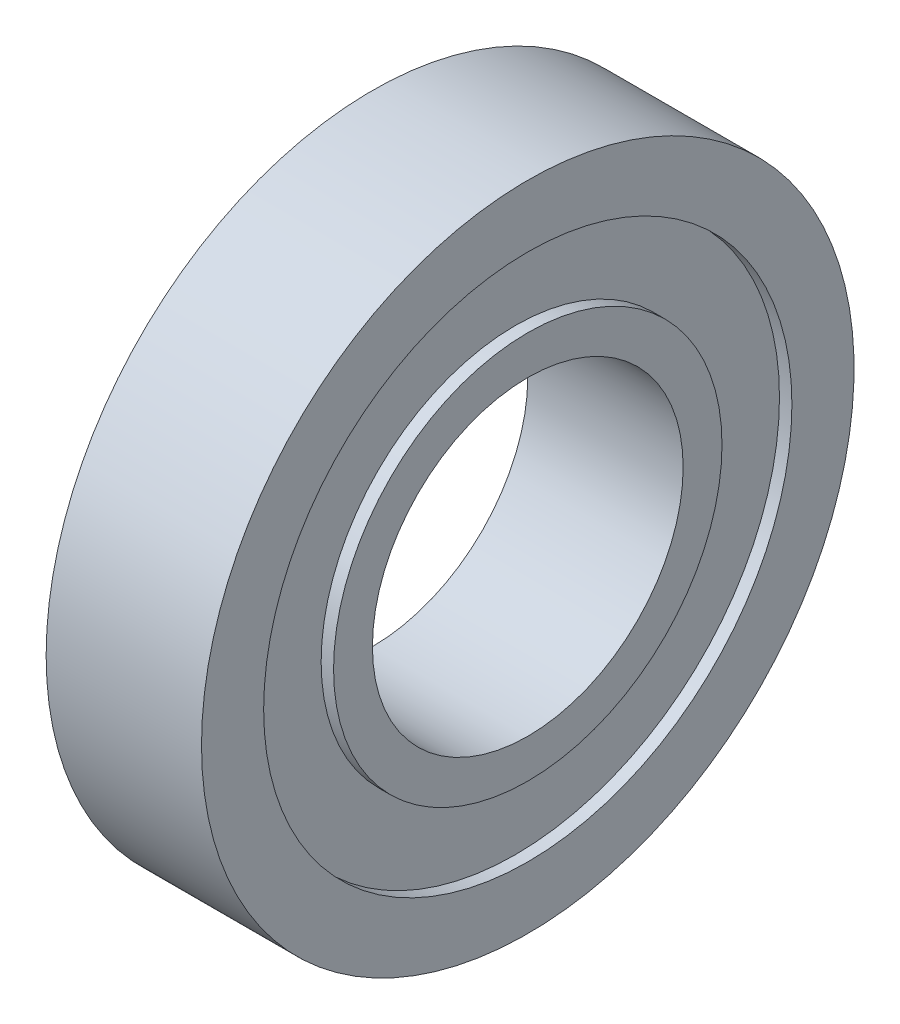
ISO-10303-21;
HEADER;
FILE_DESCRIPTION(('STEP AP214'),'2;1');
FILE_NAME('part.step','',(''),(''),'','','');
FILE_SCHEMA(('AUTOMOTIVE_DESIGN { 1 0 10303 214 1 1 1 1 }'));
ENDSEC;
DATA;
#1=APPLICATION_CONTEXT('core data for automotive mechanical design processes');
#2=APPLICATION_PROTOCOL_DEFINITION('international standard','automotive_design',2000,#1);
#3=PRODUCT_CONTEXT('',#1,'mechanical');
#4=PRODUCT('Part','Part','',(#3));
#5=PRODUCT_RELATED_PRODUCT_CATEGORY('part','',(#4));
#6=PRODUCT_DEFINITION_FORMATION('','',#4);
#7=PRODUCT_DEFINITION_CONTEXT('part definition',#1,'design');
#8=PRODUCT_DEFINITION('design','',#6,#7);
#9=PRODUCT_DEFINITION_SHAPE('','',#8);
#10=(LENGTH_UNIT() NAMED_UNIT(*) SI_UNIT(.MILLI.,.METRE.));
#11=(NAMED_UNIT(*) PLANE_ANGLE_UNIT() SI_UNIT($,.RADIAN.));
#12=(NAMED_UNIT(*) SI_UNIT($,.STERADIAN.) SOLID_ANGLE_UNIT());
#13=UNCERTAINTY_MEASURE_WITH_UNIT(LENGTH_MEASURE(1.E-05),#10,'distance_accuracy_value','');
#14=(GEOMETRIC_REPRESENTATION_CONTEXT(3) GLOBAL_UNCERTAINTY_ASSIGNED_CONTEXT((#13)) GLOBAL_UNIT_ASSIGNED_CONTEXT((#10,
#11,#12)) REPRESENTATION_CONTEXT('',''));
#15=CARTESIAN_POINT('',(0.,0.,0.));
#16=DIRECTION('',(0.,0.,1.));
#17=DIRECTION('',(1.,0.,0.));
#18=AXIS2_PLACEMENT_3D('',#15,#16,#17);
#19=CARTESIAN_POINT('',(0.,0.,0.));
#20=DIRECTION('',(-1.,0.,0.));
#21=DIRECTION('',(0.,0.,1.));
#22=AXIS2_PLACEMENT_3D('',#19,#20,#21);
#23=CYLINDRICAL_SURFACE('',#22,5.);
#24=CARTESIAN_POINT('',(5.,0.,0.));
#25=DIRECTION('',(-1.,0.,0.));
#26=DIRECTION('',(0.,0.,1.));
#27=AXIS2_PLACEMENT_3D('',#24,#25,#26);
#28=CIRCLE('',#27,5.);
#29=CARTESIAN_POINT('',(5.,0.,5.));
#30=VERTEX_POINT('',#29);
#31=EDGE_CURVE('E94',#30,#30,#28,.T.);
#32=ORIENTED_EDGE('',*,*,#31,.F.);
#33=EDGE_LOOP('',(#32));
#34=FACE_BOUND('',#33,.T.);
#35=CARTESIAN_POINT('',(0.,0.,0.));
#36=DIRECTION('',(-1.,0.,0.));
#37=DIRECTION('',(0.,0.,1.));
#38=AXIS2_PLACEMENT_3D('',#35,#36,#37);
#39=CIRCLE('',#38,5.);
#40=CARTESIAN_POINT('',(0.,0.,5.));
#41=VERTEX_POINT('',#40);
#42=EDGE_CURVE('E10',#41,#41,#39,.T.);
#43=ORIENTED_EDGE('',*,*,#42,.T.);
#44=EDGE_LOOP('',(#43));
#45=FACE_BOUND('',#44,.T.);
#46=ADVANCED_FACE('F43',(#34,#45),#23,.F.);
#47=CARTESIAN_POINT('',(0.,0.,-5.));
#48=DIRECTION('',(1.,0.,0.));
#49=DIRECTION('',(0.,0.,-1.));
#50=AXIS2_PLACEMENT_3D('',#47,#48,#49);
#51=PLANE('',#50);
#52=ORIENTED_EDGE('',*,*,#42,.F.);
#53=EDGE_LOOP('',(#52));
#54=FACE_BOUND('',#53,.T.);
#55=CARTESIAN_POINT('',(0.,0.,0.));
#56=DIRECTION('',(-1.,0.,0.));
#57=DIRECTION('',(0.,0.,1.));
#58=AXIS2_PLACEMENT_3D('',#55,#56,#57);
#59=CIRCLE('',#58,6.25);
#60=CARTESIAN_POINT('',(0.,0.,6.25));
#61=VERTEX_POINT('',#60);
#62=EDGE_CURVE('E50',#61,#61,#59,.T.);
#63=ORIENTED_EDGE('',*,*,#62,.T.);
#64=EDGE_LOOP('',(#63));
#65=FACE_BOUND('',#64,.T.);
#66=ADVANCED_FACE('F102',(#54,#65),#51,.F.);
#67=CARTESIAN_POINT('',(0.,0.,0.));
#68=DIRECTION('',(-1.,0.,0.));
#69=DIRECTION('',(0.,0.,1.));
#70=AXIS2_PLACEMENT_3D('',#67,#68,#69);
#71=CYLINDRICAL_SURFACE('',#70,6.25);
#72=ORIENTED_EDGE('',*,*,#62,.F.);
#73=EDGE_LOOP('',(#72));
#74=FACE_BOUND('',#73,.T.);
#75=CARTESIAN_POINT('',(0.4,0.,0.));
#76=DIRECTION('',(-1.,0.,0.));
#77=DIRECTION('',(0.,0.,1.));
#78=AXIS2_PLACEMENT_3D('',#75,#76,#77);
#79=CIRCLE('',#78,6.25);
#80=CARTESIAN_POINT('',(0.4,0.,6.25));
#81=VERTEX_POINT('',#80);
#82=EDGE_CURVE('E55',#81,#81,#79,.T.);
#83=ORIENTED_EDGE('',*,*,#82,.T.);
#84=EDGE_LOOP('',(#83));
#85=FACE_BOUND('',#84,.T.);
#86=ADVANCED_FACE('F106',(#74,#85),#71,.T.);
#87=CARTESIAN_POINT('',(0.4,0.,-6.25));
#88=DIRECTION('',(1.,0.,0.));
#89=DIRECTION('',(0.,0.,-1.));
#90=AXIS2_PLACEMENT_3D('',#87,#88,#89);
#91=PLANE('',#90);
#92=ORIENTED_EDGE('',*,*,#82,.F.);
#93=EDGE_LOOP('',(#92));
#94=FACE_BOUND('',#93,.T.);
#95=CARTESIAN_POINT('',(0.4,0.,0.));
#96=DIRECTION('',(-1.,0.,0.));
#97=DIRECTION('',(0.,0.,1.));
#98=AXIS2_PLACEMENT_3D('',#95,#96,#97);
#99=CIRCLE('',#98,8.5);
#100=CARTESIAN_POINT('',(0.4,0.,8.5));
#101=VERTEX_POINT('',#100);
#102=EDGE_CURVE('E60',#101,#101,#99,.T.);
#103=ORIENTED_EDGE('',*,*,#102,.T.);
#104=EDGE_LOOP('',(#103));
#105=FACE_BOUND('',#104,.T.);
#106=ADVANCED_FACE('F111',(#94,#105),#91,.F.);
#107=CARTESIAN_POINT('',(0.,0.,0.));
#108=DIRECTION('',(-1.,0.,0.));
#109=DIRECTION('',(0.,0.,1.));
#110=AXIS2_PLACEMENT_3D('',#107,#108,#109);
#111=CYLINDRICAL_SURFACE('',#110,8.5);
#112=ORIENTED_EDGE('',*,*,#102,.F.);
#113=EDGE_LOOP('',(#112));
#114=FACE_BOUND('',#113,.T.);
#115=CARTESIAN_POINT('',(0.,0.,0.));
#116=DIRECTION('',(-1.,0.,0.));
#117=DIRECTION('',(0.,0.,1.));
#118=AXIS2_PLACEMENT_3D('',#115,#116,#117);
#119=CIRCLE('',#118,8.5);
#120=CARTESIAN_POINT('',(0.,0.,8.5));
#121=VERTEX_POINT('',#120);
#122=EDGE_CURVE('E66',#121,#121,#119,.T.);
#123=ORIENTED_EDGE('',*,*,#122,.T.);
#124=EDGE_LOOP('',(#123));
#125=FACE_BOUND('',#124,.T.);
#126=ADVANCED_FACE('F117',(#114,#125),#111,.F.);
#127=CARTESIAN_POINT('',(0.,0.,-8.5));
#128=DIRECTION('',(1.,0.,0.));
#129=DIRECTION('',(0.,0.,-1.));
#130=AXIS2_PLACEMENT_3D('',#127,#128,#129);
#131=PLANE('',#130);
#132=ORIENTED_EDGE('',*,*,#122,.F.);
#133=EDGE_LOOP('',(#132));
#134=FACE_BOUND('',#133,.T.);
#135=CARTESIAN_POINT('',(0.,0.,0.));
#136=DIRECTION('',(-1.,0.,0.));
#137=DIRECTION('',(0.,0.,1.));
#138=AXIS2_PLACEMENT_3D('',#135,#136,#137);
#139=CIRCLE('',#138,10.5);
#140=CARTESIAN_POINT('',(0.,0.,10.5));
#141=VERTEX_POINT('',#140);
#142=EDGE_CURVE('E70',#141,#141,#139,.T.);
#143=ORIENTED_EDGE('',*,*,#142,.T.);
#144=EDGE_LOOP('',(#143));
#145=FACE_BOUND('',#144,.T.);
#146=ADVANCED_FACE('F121',(#134,#145),#131,.F.);
#147=CARTESIAN_POINT('',(0.,0.,0.));
#148=DIRECTION('',(-1.,0.,0.));
#149=DIRECTION('',(0.,0.,1.));
#150=AXIS2_PLACEMENT_3D('',#147,#148,#149);
#151=CYLINDRICAL_SURFACE('',#150,10.5);
#152=ORIENTED_EDGE('',*,*,#142,.F.);
#153=EDGE_LOOP('',(#152));
#154=FACE_BOUND('',#153,.T.);
#155=CARTESIAN_POINT('',(5.,0.,0.));
#156=DIRECTION('',(-1.,0.,0.));
#157=DIRECTION('',(0.,0.,1.));
#158=AXIS2_PLACEMENT_3D('',#155,#156,#157);
#159=CIRCLE('',#158,10.5);
#160=CARTESIAN_POINT('',(5.,0.,10.5));
#161=VERTEX_POINT('',#160);
#162=EDGE_CURVE('E74',#161,#161,#159,.T.);
#163=ORIENTED_EDGE('',*,*,#162,.T.);
#164=EDGE_LOOP('',(#163));
#165=FACE_BOUND('',#164,.T.);
#166=ADVANCED_FACE('F125',(#154,#165),#151,.T.);
#167=CARTESIAN_POINT('',(5.,0.,-10.5));
#168=DIRECTION('',(-1.,0.,0.));
#169=DIRECTION('',(0.,0.,1.));
#170=AXIS2_PLACEMENT_3D('',#167,#168,#169);
#171=PLANE('',#170);
#172=ORIENTED_EDGE('',*,*,#162,.F.);
#173=EDGE_LOOP('',(#172));
#174=FACE_BOUND('',#173,.T.);
#175=CARTESIAN_POINT('',(5.,0.,0.));
#176=DIRECTION('',(-1.,0.,0.));
#177=DIRECTION('',(0.,0.,1.));
#178=AXIS2_PLACEMENT_3D('',#175,#176,#177);
#179=CIRCLE('',#178,8.5);
#180=CARTESIAN_POINT('',(5.,0.,8.5));
#181=VERTEX_POINT('',#180);
#182=EDGE_CURVE('E78',#181,#181,#179,.T.);
#183=ORIENTED_EDGE('',*,*,#182,.T.);
#184=EDGE_LOOP('',(#183));
#185=FACE_BOUND('',#184,.T.);
#186=ADVANCED_FACE('F129',(#174,#185),#171,.F.);
#187=CARTESIAN_POINT('',(0.,0.,0.));
#188=DIRECTION('',(-1.,0.,0.));
#189=DIRECTION('',(0.,0.,1.));
#190=AXIS2_PLACEMENT_3D('',#187,#188,#189);
#191=CYLINDRICAL_SURFACE('',#190,8.5);
#192=ORIENTED_EDGE('',*,*,#182,.F.);
#193=EDGE_LOOP('',(#192));
#194=FACE_BOUND('',#193,.T.);
#195=CARTESIAN_POINT('',(4.6,0.,0.));
#196=DIRECTION('',(-1.,0.,0.));
#197=DIRECTION('',(0.,0.,1.));
#198=AXIS2_PLACEMENT_3D('',#195,#196,#197);
#199=CIRCLE('',#198,8.5);
#200=CARTESIAN_POINT('',(4.6,0.,8.5));
#201=VERTEX_POINT('',#200);
#202=EDGE_CURVE('E82',#201,#201,#199,.T.);
#203=ORIENTED_EDGE('',*,*,#202,.T.);
#204=EDGE_LOOP('',(#203));
#205=FACE_BOUND('',#204,.T.);
#206=ADVANCED_FACE('F133',(#194,#205),#191,.F.);
#207=CARTESIAN_POINT('',(4.6,0.,-8.5));
#208=DIRECTION('',(-1.,0.,0.));
#209=DIRECTION('',(0.,0.,1.));
#210=AXIS2_PLACEMENT_3D('',#207,#208,#209);
#211=PLANE('',#210);
#212=ORIENTED_EDGE('',*,*,#202,.F.);
#213=EDGE_LOOP('',(#212));
#214=FACE_BOUND('',#213,.T.);
#215=CARTESIAN_POINT('',(4.6,0.,0.));
#216=DIRECTION('',(-1.,0.,0.));
#217=DIRECTION('',(0.,0.,1.));
#218=AXIS2_PLACEMENT_3D('',#215,#216,#217);
#219=CIRCLE('',#218,6.25);
#220=CARTESIAN_POINT('',(4.6,0.,6.25));
#221=VERTEX_POINT('',#220);
#222=EDGE_CURVE('E86',#221,#221,#219,.T.);
#223=ORIENTED_EDGE('',*,*,#222,.T.);
#224=EDGE_LOOP('',(#223));
#225=FACE_BOUND('',#224,.T.);
#226=ADVANCED_FACE('F137',(#214,#225),#211,.F.);
#227=CARTESIAN_POINT('',(0.,0.,0.));
#228=DIRECTION('',(-1.,0.,0.));
#229=DIRECTION('',(0.,0.,1.));
#230=AXIS2_PLACEMENT_3D('',#227,#228,#229);
#231=CYLINDRICAL_SURFACE('',#230,6.25);
#232=ORIENTED_EDGE('',*,*,#222,.F.);
#233=EDGE_LOOP('',(#232));
#234=FACE_BOUND('',#233,.T.);
#235=CARTESIAN_POINT('',(5.,0.,0.));
#236=DIRECTION('',(-1.,0.,0.));
#237=DIRECTION('',(0.,0.,1.));
#238=AXIS2_PLACEMENT_3D('',#235,#236,#237);
#239=CIRCLE('',#238,6.25);
#240=CARTESIAN_POINT('',(5.,0.,6.25));
#241=VERTEX_POINT('',#240);
#242=EDGE_CURVE('E90',#241,#241,#239,.T.);
#243=ORIENTED_EDGE('',*,*,#242,.T.);
#244=EDGE_LOOP('',(#243));
#245=FACE_BOUND('',#244,.T.);
#246=ADVANCED_FACE('F141',(#234,#245),#231,.T.);
#247=CARTESIAN_POINT('',(5.,0.,-6.25));
#248=DIRECTION('',(-1.,0.,0.));
#249=DIRECTION('',(0.,0.,1.));
#250=AXIS2_PLACEMENT_3D('',#247,#248,#249);
#251=PLANE('',#250);
#252=ORIENTED_EDGE('',*,*,#242,.F.);
#253=EDGE_LOOP('',(#252));
#254=FACE_BOUND('',#253,.T.);
#255=ORIENTED_EDGE('',*,*,#31,.T.);
#256=EDGE_LOOP('',(#255));
#257=FACE_BOUND('',#256,.T.);
#258=ADVANCED_FACE('F99',(#254,#257),#251,.F.);
#259=CLOSED_SHELL('',(#46,#66,#86,#106,#126,#146,#166,#186,#206,#226,#246,#258));
#260=MANIFOLD_SOLID_BREP('B2',#259);
#261=ADVANCED_BREP_SHAPE_REPRESENTATION('',(#18,#260),#14);
#262=SHAPE_DEFINITION_REPRESENTATION(#9,#261);
ENDSEC;
END-ISO-10303-21;
